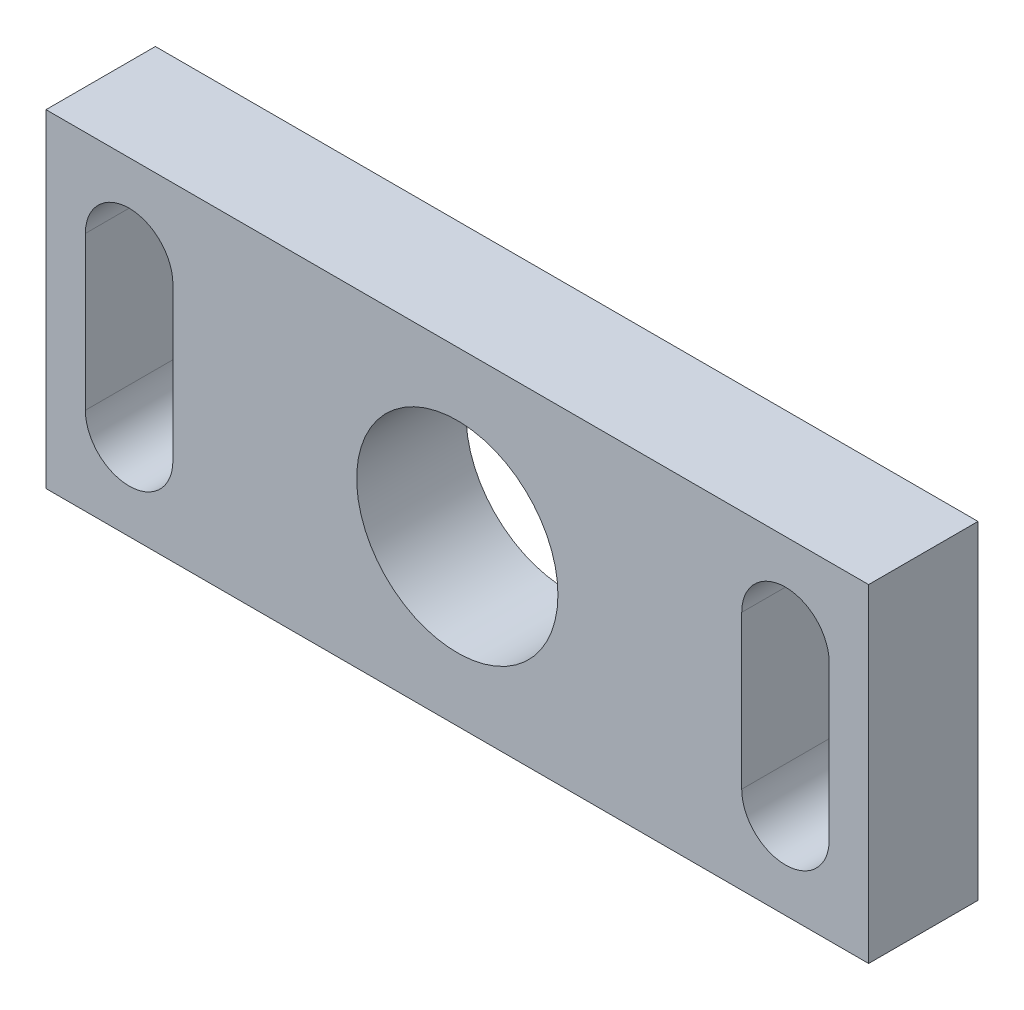
ISO-10303-21;
HEADER;
FILE_DESCRIPTION(('STEP AP214'),'2;1');
FILE_NAME('part.step','',(''),(''),'','','');
FILE_SCHEMA(('AUTOMOTIVE_DESIGN { 1 0 10303 214 1 1 1 1 }'));
ENDSEC;
DATA;
#1=APPLICATION_CONTEXT('core data for automotive mechanical design processes');
#2=APPLICATION_PROTOCOL_DEFINITION('international standard','automotive_design',2000,#1);
#3=PRODUCT_CONTEXT('',#1,'mechanical');
#4=PRODUCT('Part','Part','',(#3));
#5=PRODUCT_RELATED_PRODUCT_CATEGORY('part','',(#4));
#6=PRODUCT_DEFINITION_FORMATION('','',#4);
#7=PRODUCT_DEFINITION_CONTEXT('part definition',#1,'design');
#8=PRODUCT_DEFINITION('design','',#6,#7);
#9=PRODUCT_DEFINITION_SHAPE('','',#8);
#10=(LENGTH_UNIT() NAMED_UNIT(*) SI_UNIT(.MILLI.,.METRE.));
#11=(NAMED_UNIT(*) PLANE_ANGLE_UNIT() SI_UNIT($,.RADIAN.));
#12=(NAMED_UNIT(*) SI_UNIT($,.STERADIAN.) SOLID_ANGLE_UNIT());
#13=UNCERTAINTY_MEASURE_WITH_UNIT(LENGTH_MEASURE(1.E-05),#10,'distance_accuracy_value','');
#14=(GEOMETRIC_REPRESENTATION_CONTEXT(3) GLOBAL_UNCERTAINTY_ASSIGNED_CONTEXT((#13)) GLOBAL_UNIT_ASSIGNED_CONTEXT((#10,
#11,#12)) REPRESENTATION_CONTEXT('',''));
#15=CARTESIAN_POINT('',(0.,0.,0.));
#16=DIRECTION('',(0.,0.,1.));
#17=DIRECTION('',(1.,0.,0.));
#18=AXIS2_PLACEMENT_3D('',#15,#16,#17);
#19=CARTESIAN_POINT('',(18.8,7.5,5.));
#20=DIRECTION('',(-1.,0.,0.));
#21=DIRECTION('',(0.,-1.,0.));
#22=AXIS2_PLACEMENT_3D('',#19,#20,#21);
#23=PLANE('',#22);
#24=DIRECTION('',(0.,1.,0.));
#25=VECTOR('',#24,1.);
#26=CARTESIAN_POINT('',(18.8,7.5,0.));
#27=LINE('',#26,#25);
#28=CARTESIAN_POINT('',(18.8,-7.5,0.));
#29=VERTEX_POINT('',#28);
#30=CARTESIAN_POINT('',(18.8,7.5,0.));
#31=VERTEX_POINT('',#30);
#32=EDGE_CURVE('E177',#29,#31,#27,.T.);
#33=ORIENTED_EDGE('',*,*,#32,.T.);
#34=DIRECTION('',(0.,0.,-1.));
#35=VECTOR('',#34,1.);
#36=CARTESIAN_POINT('',(18.8,7.5,5.));
#37=LINE('',#36,#35);
#38=CARTESIAN_POINT('',(18.8,7.5,5.));
#39=VERTEX_POINT('',#38);
#40=EDGE_CURVE('E11',#39,#31,#37,.T.);
#41=ORIENTED_EDGE('',*,*,#40,.F.);
#42=DIRECTION('',(0.,1.,0.));
#43=VECTOR('',#42,1.);
#44=CARTESIAN_POINT('',(18.8,7.5,5.));
#45=LINE('',#44,#43);
#46=CARTESIAN_POINT('',(18.8,-7.5,5.));
#47=VERTEX_POINT('',#46);
#48=EDGE_CURVE('E219',#47,#39,#45,.T.);
#49=ORIENTED_EDGE('',*,*,#48,.F.);
#50=DIRECTION('',(0.,0.,-1.));
#51=VECTOR('',#50,1.);
#52=CARTESIAN_POINT('',(18.8,-7.5,5.));
#53=LINE('',#52,#51);
#54=EDGE_CURVE('E233',#47,#29,#53,.T.);
#55=ORIENTED_EDGE('',*,*,#54,.T.);
#56=EDGE_LOOP('',(#33,#41,#49,#55));
#57=FACE_BOUND('',#56,.T.);
#58=ADVANCED_FACE('F45',(#57),#23,.F.);
#59=CARTESIAN_POINT('',(-18.8,7.5,5.));
#60=DIRECTION('',(0.,-1.,0.));
#61=DIRECTION('',(0.,0.,-1.));
#62=AXIS2_PLACEMENT_3D('',#59,#60,#61);
#63=PLANE('',#62);
#64=DIRECTION('',(-1.,0.,0.));
#65=VECTOR('',#64,1.);
#66=CARTESIAN_POINT('',(-18.8,7.5,0.));
#67=LINE('',#66,#65);
#68=CARTESIAN_POINT('',(-18.8,7.5,0.));
#69=VERTEX_POINT('',#68);
#70=EDGE_CURVE('E237',#31,#69,#67,.T.);
#71=ORIENTED_EDGE('',*,*,#70,.T.);
#72=DIRECTION('',(0.,0.,-1.));
#73=VECTOR('',#72,1.);
#74=CARTESIAN_POINT('',(-18.8,7.5,5.));
#75=LINE('',#74,#73);
#76=CARTESIAN_POINT('',(-18.8,7.5,5.));
#77=VERTEX_POINT('',#76);
#78=EDGE_CURVE('E53',#77,#69,#75,.T.);
#79=ORIENTED_EDGE('',*,*,#78,.F.);
#80=DIRECTION('',(-1.,0.,0.));
#81=VECTOR('',#80,1.);
#82=CARTESIAN_POINT('',(-18.8,7.5,5.));
#83=LINE('',#82,#81);
#84=EDGE_CURVE('E223',#39,#77,#83,.T.);
#85=ORIENTED_EDGE('',*,*,#84,.F.);
#86=ORIENTED_EDGE('',*,*,#40,.T.);
#87=EDGE_LOOP('',(#71,#79,#85,#86));
#88=FACE_BOUND('',#87,.T.);
#89=ADVANCED_FACE('F272',(#88),#63,.F.);
#90=CARTESIAN_POINT('',(-18.8,7.5,5.));
#91=DIRECTION('',(1.,0.,0.));
#92=DIRECTION('',(0.,0.,-1.));
#93=AXIS2_PLACEMENT_3D('',#90,#91,#92);
#94=PLANE('',#93);
#95=DIRECTION('',(0.,-1.,0.));
#96=VECTOR('',#95,1.);
#97=CARTESIAN_POINT('',(-18.8,7.5,0.));
#98=LINE('',#97,#96);
#99=CARTESIAN_POINT('',(-18.8,-7.5,0.));
#100=VERTEX_POINT('',#99);
#101=EDGE_CURVE('E240',#69,#100,#98,.T.);
#102=ORIENTED_EDGE('',*,*,#101,.T.);
#103=DIRECTION('',(0.,0.,-1.));
#104=VECTOR('',#103,1.);
#105=CARTESIAN_POINT('',(-18.8,-7.5,5.));
#106=LINE('',#105,#104);
#107=CARTESIAN_POINT('',(-18.8,-7.5,5.));
#108=VERTEX_POINT('',#107);
#109=EDGE_CURVE('E248',#108,#100,#106,.T.);
#110=ORIENTED_EDGE('',*,*,#109,.F.);
#111=DIRECTION('',(0.,-1.,0.));
#112=VECTOR('',#111,1.);
#113=CARTESIAN_POINT('',(-18.8,7.5,5.));
#114=LINE('',#113,#112);
#115=EDGE_CURVE('E227',#77,#108,#114,.T.);
#116=ORIENTED_EDGE('',*,*,#115,.F.);
#117=ORIENTED_EDGE('',*,*,#78,.T.);
#118=EDGE_LOOP('',(#102,#110,#116,#117));
#119=FACE_BOUND('',#118,.T.);
#120=ADVANCED_FACE('F257',(#119),#94,.F.);
#121=CARTESIAN_POINT('',(-18.8,-7.5,5.));
#122=DIRECTION('',(0.,1.,0.));
#123=DIRECTION('',(0.,0.,1.));
#124=AXIS2_PLACEMENT_3D('',#121,#122,#123);
#125=PLANE('',#124);
#126=DIRECTION('',(1.,0.,0.));
#127=VECTOR('',#126,1.);
#128=CARTESIAN_POINT('',(-18.8,-7.5,0.));
#129=LINE('',#128,#127);
#130=EDGE_CURVE('E224',#100,#29,#129,.T.);
#131=ORIENTED_EDGE('',*,*,#130,.T.);
#132=ORIENTED_EDGE('',*,*,#54,.F.);
#133=DIRECTION('',(1.,0.,0.));
#134=VECTOR('',#133,1.);
#135=CARTESIAN_POINT('',(-18.8,-7.5,5.));
#136=LINE('',#135,#134);
#137=EDGE_CURVE('E230',#108,#47,#136,.T.);
#138=ORIENTED_EDGE('',*,*,#137,.F.);
#139=ORIENTED_EDGE('',*,*,#109,.T.);
#140=EDGE_LOOP('',(#131,#132,#138,#139));
#141=FACE_BOUND('',#140,.T.);
#142=ADVANCED_FACE('F266',(#141),#125,.F.);
#143=CARTESIAN_POINT('',(0.,0.,5.));
#144=DIRECTION('',(0.,0.,1.));
#145=DIRECTION('',(1.,0.,0.));
#146=AXIS2_PLACEMENT_3D('',#143,#144,#145);
#147=PLANE('',#146);
#148=CARTESIAN_POINT('',(0.,0.,5.));
#149=DIRECTION('',(0.,0.,1.));
#150=DIRECTION('',(1.,0.,0.));
#151=AXIS2_PLACEMENT_3D('',#148,#149,#150);
#152=CIRCLE('',#151,4.6);
#153=CARTESIAN_POINT('',(4.6,0.,5.));
#154=VERTEX_POINT('',#153);
#155=EDGE_CURVE('E324',#154,#154,#152,.T.);
#156=ORIENTED_EDGE('',*,*,#155,.F.);
#157=EDGE_LOOP('',(#156));
#158=FACE_BOUND('',#157,.T.);
#159=CARTESIAN_POINT('',(-15.,3.5,5.));
#160=DIRECTION('',(0.,0.,1.));
#161=DIRECTION('',(1.,0.,0.));
#162=AXIS2_PLACEMENT_3D('',#159,#160,#161);
#163=CIRCLE('',#162,2.);
#164=CARTESIAN_POINT('',(-13.,3.5,5.));
#165=VERTEX_POINT('',#164);
#166=CARTESIAN_POINT('',(-17.,3.5,5.));
#167=VERTEX_POINT('',#166);
#168=EDGE_CURVE('E60',#165,#167,#163,.T.);
#169=ORIENTED_EDGE('',*,*,#168,.F.);
#170=DIRECTION('',(0.,1.,0.));
#171=VECTOR('',#170,1.);
#172=CARTESIAN_POINT('',(-13.,3.5,5.));
#173=LINE('',#172,#171);
#174=CARTESIAN_POINT('',(-13.,-3.5,5.));
#175=VERTEX_POINT('',#174);
#176=EDGE_CURVE('E160',#175,#165,#173,.T.);
#177=ORIENTED_EDGE('',*,*,#176,.F.);
#178=CARTESIAN_POINT('',(-15.,-3.5,5.));
#179=DIRECTION('',(0.,0.,1.));
#180=DIRECTION('',(1.,0.,0.));
#181=AXIS2_PLACEMENT_3D('',#178,#179,#180);
#182=CIRCLE('',#181,2.);
#183=CARTESIAN_POINT('',(-17.,-3.5,5.));
#184=VERTEX_POINT('',#183);
#185=EDGE_CURVE('E141',#184,#175,#182,.T.);
#186=ORIENTED_EDGE('',*,*,#185,.F.);
#187=DIRECTION('',(0.,-1.,0.));
#188=VECTOR('',#187,1.);
#189=CARTESIAN_POINT('',(-17.,3.5,5.));
#190=LINE('',#189,#188);
#191=EDGE_CURVE('E152',#167,#184,#190,.T.);
#192=ORIENTED_EDGE('',*,*,#191,.F.);
#193=EDGE_LOOP('',(#169,#177,#186,#192));
#194=FACE_BOUND('',#193,.T.);
#195=CARTESIAN_POINT('',(15.,3.5,5.));
#196=DIRECTION('',(0.,0.,1.));
#197=DIRECTION('',(1.,0.,0.));
#198=AXIS2_PLACEMENT_3D('',#195,#196,#197);
#199=CIRCLE('',#198,2.);
#200=CARTESIAN_POINT('',(17.,3.5,5.));
#201=VERTEX_POINT('',#200);
#202=CARTESIAN_POINT('',(13.,3.5,5.));
#203=VERTEX_POINT('',#202);
#204=EDGE_CURVE('E68',#201,#203,#199,.T.);
#205=ORIENTED_EDGE('',*,*,#204,.F.);
#206=DIRECTION('',(0.,1.,0.));
#207=VECTOR('',#206,1.);
#208=CARTESIAN_POINT('',(17.,3.5,5.));
#209=LINE('',#208,#207);
#210=CARTESIAN_POINT('',(17.,-3.5,5.));
#211=VERTEX_POINT('',#210);
#212=EDGE_CURVE('E187',#211,#201,#209,.T.);
#213=ORIENTED_EDGE('',*,*,#212,.F.);
#214=CARTESIAN_POINT('',(15.,-3.5,5.));
#215=DIRECTION('',(0.,0.,1.));
#216=DIRECTION('',(1.,0.,0.));
#217=AXIS2_PLACEMENT_3D('',#214,#215,#216);
#218=CIRCLE('',#217,2.);
#219=CARTESIAN_POINT('',(13.,-3.5,5.));
#220=VERTEX_POINT('',#219);
#221=EDGE_CURVE('E201',#220,#211,#218,.T.);
#222=ORIENTED_EDGE('',*,*,#221,.F.);
#223=DIRECTION('',(0.,-1.,0.));
#224=VECTOR('',#223,1.);
#225=CARTESIAN_POINT('',(13.,3.5,5.));
#226=LINE('',#225,#224);
#227=EDGE_CURVE('E205',#203,#220,#226,.T.);
#228=ORIENTED_EDGE('',*,*,#227,.F.);
#229=EDGE_LOOP('',(#205,#213,#222,#228));
#230=FACE_BOUND('',#229,.T.);
#231=ORIENTED_EDGE('',*,*,#48,.T.);
#232=ORIENTED_EDGE('',*,*,#84,.T.);
#233=ORIENTED_EDGE('',*,*,#115,.T.);
#234=ORIENTED_EDGE('',*,*,#137,.T.);
#235=EDGE_LOOP('',(#231,#232,#233,#234));
#236=FACE_BOUND('',#235,.T.);
#237=ADVANCED_FACE('F157',(#158,#194,#230,#236),#147,.T.);
#238=CARTESIAN_POINT('',(0.,0.,0.));
#239=DIRECTION('',(0.,0.,1.));
#240=DIRECTION('',(1.,0.,0.));
#241=AXIS2_PLACEMENT_3D('',#238,#239,#240);
#242=PLANE('',#241);
#243=CARTESIAN_POINT('',(0.,0.,0.));
#244=DIRECTION('',(0.,0.,1.));
#245=DIRECTION('',(1.,0.,0.));
#246=AXIS2_PLACEMENT_3D('',#243,#244,#245);
#247=CIRCLE('',#246,4.6);
#248=CARTESIAN_POINT('',(4.6,0.,0.));
#249=VERTEX_POINT('',#248);
#250=EDGE_CURVE('E183',#249,#249,#247,.F.);
#251=ORIENTED_EDGE('',*,*,#250,.F.);
#252=EDGE_LOOP('',(#251));
#253=FACE_BOUND('',#252,.T.);
#254=DIRECTION('',(0.,-1.,0.));
#255=VECTOR('',#254,1.);
#256=CARTESIAN_POINT('',(-13.,3.5,0.));
#257=LINE('',#256,#255);
#258=CARTESIAN_POINT('',(-13.,3.5,0.));
#259=VERTEX_POINT('',#258);
#260=CARTESIAN_POINT('',(-13.,-3.5,0.));
#261=VERTEX_POINT('',#260);
#262=EDGE_CURVE('E332',#259,#261,#257,.T.);
#263=ORIENTED_EDGE('',*,*,#262,.F.);
#264=CARTESIAN_POINT('',(-15.,3.5,0.));
#265=DIRECTION('',(0.,0.,1.));
#266=DIRECTION('',(1.,0.,0.));
#267=AXIS2_PLACEMENT_3D('',#264,#265,#266);
#268=CIRCLE('',#267,2.);
#269=CARTESIAN_POINT('',(-17.,3.5,0.));
#270=VERTEX_POINT('',#269);
#271=EDGE_CURVE('E178',#270,#259,#268,.F.);
#272=ORIENTED_EDGE('',*,*,#271,.F.);
#273=DIRECTION('',(0.,1.,0.));
#274=VECTOR('',#273,1.);
#275=CARTESIAN_POINT('',(-17.,3.5,0.));
#276=LINE('',#275,#274);
#277=CARTESIAN_POINT('',(-17.,-3.5,0.));
#278=VERTEX_POINT('',#277);
#279=EDGE_CURVE('E174',#278,#270,#276,.T.);
#280=ORIENTED_EDGE('',*,*,#279,.F.);
#281=CARTESIAN_POINT('',(-15.,-3.5,0.));
#282=DIRECTION('',(0.,0.,1.));
#283=DIRECTION('',(1.,0.,0.));
#284=AXIS2_PLACEMENT_3D('',#281,#282,#283);
#285=CIRCLE('',#284,2.);
#286=EDGE_CURVE('E144',#261,#278,#285,.F.);
#287=ORIENTED_EDGE('',*,*,#286,.F.);
#288=EDGE_LOOP('',(#263,#272,#280,#287));
#289=FACE_BOUND('',#288,.T.);
#290=DIRECTION('',(0.,-1.,0.));
#291=VECTOR('',#290,1.);
#292=CARTESIAN_POINT('',(17.,3.5,0.));
#293=LINE('',#292,#291);
#294=CARTESIAN_POINT('',(17.,3.5,0.));
#295=VERTEX_POINT('',#294);
#296=CARTESIAN_POINT('',(17.,-3.5,0.));
#297=VERTEX_POINT('',#296);
#298=EDGE_CURVE('E213',#295,#297,#293,.T.);
#299=ORIENTED_EDGE('',*,*,#298,.F.);
#300=CARTESIAN_POINT('',(15.,3.5,0.));
#301=DIRECTION('',(0.,0.,1.));
#302=DIRECTION('',(1.,0.,0.));
#303=AXIS2_PLACEMENT_3D('',#300,#301,#302);
#304=CIRCLE('',#303,2.);
#305=CARTESIAN_POINT('',(13.,3.5,0.));
#306=VERTEX_POINT('',#305);
#307=EDGE_CURVE('E182',#306,#295,#304,.F.);
#308=ORIENTED_EDGE('',*,*,#307,.F.);
#309=DIRECTION('',(0.,1.,0.));
#310=VECTOR('',#309,1.);
#311=CARTESIAN_POINT('',(13.,3.5,0.));
#312=LINE('',#311,#310);
#313=CARTESIAN_POINT('',(13.,-3.5,0.));
#314=VERTEX_POINT('',#313);
#315=EDGE_CURVE('E179',#314,#306,#312,.T.);
#316=ORIENTED_EDGE('',*,*,#315,.F.);
#317=CARTESIAN_POINT('',(15.,-3.5,0.));
#318=DIRECTION('',(0.,0.,1.));
#319=DIRECTION('',(1.,0.,0.));
#320=AXIS2_PLACEMENT_3D('',#317,#318,#319);
#321=CIRCLE('',#320,2.);
#322=EDGE_CURVE('E197',#297,#314,#321,.F.);
#323=ORIENTED_EDGE('',*,*,#322,.F.);
#324=EDGE_LOOP('',(#299,#308,#316,#323));
#325=FACE_BOUND('',#324,.T.);
#326=ORIENTED_EDGE('',*,*,#32,.F.);
#327=ORIENTED_EDGE('',*,*,#130,.F.);
#328=ORIENTED_EDGE('',*,*,#101,.F.);
#329=ORIENTED_EDGE('',*,*,#70,.F.);
#330=EDGE_LOOP('',(#326,#327,#328,#329));
#331=FACE_BOUND('',#330,.T.);
#332=ADVANCED_FACE('F263',(#253,#289,#325,#331),#242,.F.);
#333=CARTESIAN_POINT('',(15.,3.5,-11.7046999107196));
#334=DIRECTION('',(0.,0.,1.));
#335=DIRECTION('',(1.,0.,0.));
#336=AXIS2_PLACEMENT_3D('',#333,#334,#335);
#337=CYLINDRICAL_SURFACE('',#336,2.);
#338=ORIENTED_EDGE('',*,*,#307,.T.);
#339=DIRECTION('',(0.,0.,1.));
#340=VECTOR('',#339,1.);
#341=CARTESIAN_POINT('',(17.,3.5,-11.7046999107196));
#342=LINE('',#341,#340);
#343=EDGE_CURVE('E194',#295,#201,#342,.T.);
#344=ORIENTED_EDGE('',*,*,#343,.T.);
#345=ORIENTED_EDGE('',*,*,#204,.T.);
#346=DIRECTION('',(0.,0.,1.));
#347=VECTOR('',#346,1.);
#348=CARTESIAN_POINT('',(13.,3.5,-11.7046999107196));
#349=LINE('',#348,#347);
#350=EDGE_CURVE('E184',#306,#203,#349,.T.);
#351=ORIENTED_EDGE('',*,*,#350,.F.);
#352=EDGE_LOOP('',(#338,#344,#345,#351));
#353=FACE_BOUND('',#352,.T.);
#354=ADVANCED_FACE('F284',(#353),#337,.F.);
#355=CARTESIAN_POINT('',(17.,3.5,-11.7046999107196));
#356=DIRECTION('',(1.,0.,0.));
#357=DIRECTION('',(0.,0.,-1.));
#358=AXIS2_PLACEMENT_3D('',#355,#356,#357);
#359=PLANE('',#358);
#360=ORIENTED_EDGE('',*,*,#298,.T.);
#361=DIRECTION('',(0.,0.,1.));
#362=VECTOR('',#361,1.);
#363=CARTESIAN_POINT('',(17.,-3.5,-11.7046999107196));
#364=LINE('',#363,#362);
#365=EDGE_CURVE('E191',#297,#211,#364,.T.);
#366=ORIENTED_EDGE('',*,*,#365,.T.);
#367=ORIENTED_EDGE('',*,*,#212,.T.);
#368=ORIENTED_EDGE('',*,*,#343,.F.);
#369=EDGE_LOOP('',(#360,#366,#367,#368));
#370=FACE_BOUND('',#369,.T.);
#371=ADVANCED_FACE('F289',(#370),#359,.F.);
#372=CARTESIAN_POINT('',(15.,-3.5,-11.7046999107196));
#373=DIRECTION('',(0.,0.,1.));
#374=DIRECTION('',(1.,0.,0.));
#375=AXIS2_PLACEMENT_3D('',#372,#373,#374);
#376=CYLINDRICAL_SURFACE('',#375,2.);
#377=ORIENTED_EDGE('',*,*,#322,.T.);
#378=DIRECTION('',(0.,0.,1.));
#379=VECTOR('',#378,1.);
#380=CARTESIAN_POINT('',(13.,-3.5,-11.7046999107196));
#381=LINE('',#380,#379);
#382=EDGE_CURVE('E188',#314,#220,#381,.T.);
#383=ORIENTED_EDGE('',*,*,#382,.T.);
#384=ORIENTED_EDGE('',*,*,#221,.T.);
#385=ORIENTED_EDGE('',*,*,#365,.F.);
#386=EDGE_LOOP('',(#377,#383,#384,#385));
#387=FACE_BOUND('',#386,.T.);
#388=ADVANCED_FACE('F292',(#387),#376,.F.);
#389=CARTESIAN_POINT('',(13.,3.5,-11.7046999107196));
#390=DIRECTION('',(-1.,0.,0.));
#391=DIRECTION('',(0.,0.,1.));
#392=AXIS2_PLACEMENT_3D('',#389,#390,#391);
#393=PLANE('',#392);
#394=ORIENTED_EDGE('',*,*,#315,.T.);
#395=ORIENTED_EDGE('',*,*,#350,.T.);
#396=ORIENTED_EDGE('',*,*,#227,.T.);
#397=ORIENTED_EDGE('',*,*,#382,.F.);
#398=EDGE_LOOP('',(#394,#395,#396,#397));
#399=FACE_BOUND('',#398,.T.);
#400=ADVANCED_FACE('F296',(#399),#393,.F.);
#401=CARTESIAN_POINT('',(-15.,3.5,-11.7046999107196));
#402=DIRECTION('',(0.,0.,1.));
#403=DIRECTION('',(1.,0.,0.));
#404=AXIS2_PLACEMENT_3D('',#401,#402,#403);
#405=CYLINDRICAL_SURFACE('',#404,2.);
#406=ORIENTED_EDGE('',*,*,#271,.T.);
#407=DIRECTION('',(0.,0.,1.));
#408=VECTOR('',#407,1.);
#409=CARTESIAN_POINT('',(-13.,3.5,-11.7046999107196));
#410=LINE('',#409,#408);
#411=EDGE_CURVE('E167',#259,#165,#410,.T.);
#412=ORIENTED_EDGE('',*,*,#411,.T.);
#413=ORIENTED_EDGE('',*,*,#168,.T.);
#414=DIRECTION('',(0.,0.,1.));
#415=VECTOR('',#414,1.);
#416=CARTESIAN_POINT('',(-17.,3.5,-11.7046999107196));
#417=LINE('',#416,#415);
#418=EDGE_CURVE('E149',#270,#167,#417,.T.);
#419=ORIENTED_EDGE('',*,*,#418,.F.);
#420=EDGE_LOOP('',(#406,#412,#413,#419));
#421=FACE_BOUND('',#420,.T.);
#422=ADVANCED_FACE('F300',(#421),#405,.F.);
#423=CARTESIAN_POINT('',(-13.,3.5,-11.7046999107196));
#424=DIRECTION('',(1.,0.,0.));
#425=DIRECTION('',(0.,1.,0.));
#426=AXIS2_PLACEMENT_3D('',#423,#424,#425);
#427=PLANE('',#426);
#428=ORIENTED_EDGE('',*,*,#262,.T.);
#429=DIRECTION('',(0.,0.,1.));
#430=VECTOR('',#429,1.);
#431=CARTESIAN_POINT('',(-13.,-3.5,-11.7046999107196));
#432=LINE('',#431,#430);
#433=EDGE_CURVE('E148',#261,#175,#432,.T.);
#434=ORIENTED_EDGE('',*,*,#433,.T.);
#435=ORIENTED_EDGE('',*,*,#176,.T.);
#436=ORIENTED_EDGE('',*,*,#411,.F.);
#437=EDGE_LOOP('',(#428,#434,#435,#436));
#438=FACE_BOUND('',#437,.T.);
#439=ADVANCED_FACE('F306',(#438),#427,.F.);
#440=CARTESIAN_POINT('',(-15.,-3.5,-11.7046999107196));
#441=DIRECTION('',(0.,0.,1.));
#442=DIRECTION('',(1.,0.,0.));
#443=AXIS2_PLACEMENT_3D('',#440,#441,#442);
#444=CYLINDRICAL_SURFACE('',#443,2.);
#445=ORIENTED_EDGE('',*,*,#286,.T.);
#446=DIRECTION('',(0.,0.,1.));
#447=VECTOR('',#446,1.);
#448=CARTESIAN_POINT('',(-17.,-3.5,-11.7046999107196));
#449=LINE('',#448,#447);
#450=EDGE_CURVE('E136',#278,#184,#449,.T.);
#451=ORIENTED_EDGE('',*,*,#450,.T.);
#452=ORIENTED_EDGE('',*,*,#185,.T.);
#453=ORIENTED_EDGE('',*,*,#433,.F.);
#454=EDGE_LOOP('',(#445,#451,#452,#453));
#455=FACE_BOUND('',#454,.T.);
#456=ADVANCED_FACE('F138',(#455),#444,.F.);
#457=CARTESIAN_POINT('',(-17.,3.5,-11.7046999107196));
#458=DIRECTION('',(-1.,0.,0.));
#459=DIRECTION('',(0.,-1.,0.));
#460=AXIS2_PLACEMENT_3D('',#457,#458,#459);
#461=PLANE('',#460);
#462=ORIENTED_EDGE('',*,*,#279,.T.);
#463=ORIENTED_EDGE('',*,*,#418,.T.);
#464=ORIENTED_EDGE('',*,*,#191,.T.);
#465=ORIENTED_EDGE('',*,*,#450,.F.);
#466=EDGE_LOOP('',(#462,#463,#464,#465));
#467=FACE_BOUND('',#466,.T.);
#468=ADVANCED_FACE('F153',(#467),#461,.F.);
#469=CARTESIAN_POINT('',(0.,0.,-13.0107647738325));
#470=DIRECTION('',(0.,0.,1.));
#471=DIRECTION('',(1.,0.,0.));
#472=AXIS2_PLACEMENT_3D('',#469,#470,#471);
#473=CYLINDRICAL_SURFACE('',#472,4.6);
#474=ORIENTED_EDGE('',*,*,#250,.T.);
#475=EDGE_LOOP('',(#474));
#476=FACE_BOUND('',#475,.T.);
#477=ORIENTED_EDGE('',*,*,#155,.T.);
#478=EDGE_LOOP('',(#477));
#479=FACE_BOUND('',#478,.T.);
#480=ADVANCED_FACE('F309',(#476,#479),#473,.F.);
#481=CLOSED_SHELL('',(#58,#89,#120,#142,#237,#332,#354,#371,#388,#400,#422,#439,#456,#468,#480));
#482=MANIFOLD_SOLID_BREP('B2',#481);
#483=ADVANCED_BREP_SHAPE_REPRESENTATION('',(#18,#482),#14);
#484=SHAPE_DEFINITION_REPRESENTATION(#9,#483);
ENDSEC;
END-ISO-10303-21;
